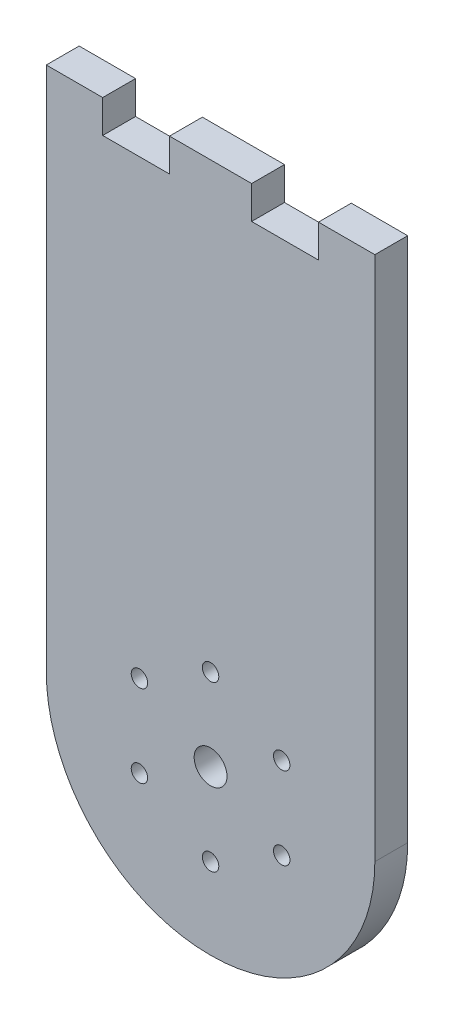
ISO-10303-21;
HEADER;
FILE_DESCRIPTION(('STEP AP214'),'2;1');
FILE_NAME('part.step','',(''),(''),'','','');
FILE_SCHEMA(('AUTOMOTIVE_DESIGN { 1 0 10303 214 1 1 1 1 }'));
ENDSEC;
DATA;
#1=APPLICATION_CONTEXT('core data for automotive mechanical design processes');
#2=APPLICATION_PROTOCOL_DEFINITION('international standard','automotive_design',2000,#1);
#3=PRODUCT_CONTEXT('',#1,'mechanical');
#4=PRODUCT('Part','Part','',(#3));
#5=PRODUCT_RELATED_PRODUCT_CATEGORY('part','',(#4));
#6=PRODUCT_DEFINITION_FORMATION('','',#4);
#7=PRODUCT_DEFINITION_CONTEXT('part definition',#1,'design');
#8=PRODUCT_DEFINITION('design','',#6,#7);
#9=PRODUCT_DEFINITION_SHAPE('','',#8);
#10=(LENGTH_UNIT() NAMED_UNIT(*) SI_UNIT(.MILLI.,.METRE.));
#11=(NAMED_UNIT(*) PLANE_ANGLE_UNIT() SI_UNIT($,.RADIAN.));
#12=(NAMED_UNIT(*) SI_UNIT($,.STERADIAN.) SOLID_ANGLE_UNIT());
#13=UNCERTAINTY_MEASURE_WITH_UNIT(LENGTH_MEASURE(1.E-05),#10,'distance_accuracy_value','');
#14=(GEOMETRIC_REPRESENTATION_CONTEXT(3) GLOBAL_UNCERTAINTY_ASSIGNED_CONTEXT((#13)) GLOBAL_UNIT_ASSIGNED_CONTEXT((#10,
#11,#12)) REPRESENTATION_CONTEXT('',''));
#15=CARTESIAN_POINT('',(0.,0.,0.));
#16=DIRECTION('',(0.,0.,1.));
#17=DIRECTION('',(1.,0.,0.));
#18=AXIS2_PLACEMENT_3D('',#15,#16,#17);
#19=CARTESIAN_POINT('',(-0.100000000000006,-16.55,3.));
#20=DIRECTION('',(0.,0.,1.));
#21=DIRECTION('',(1.,0.,0.));
#22=AXIS2_PLACEMENT_3D('',#19,#20,#21);
#23=PLANE('',#22);
#24=CARTESIAN_POINT('',(-6.49519052838329,-20.3,3.));
#25=DIRECTION('',(0.,0.,1.));
#26=DIRECTION('',(1.,0.,0.));
#27=AXIS2_PLACEMENT_3D('',#24,#25,#26);
#28=CIRCLE('',#27,0.750000000000064);
#29=CARTESIAN_POINT('',(-5.74519052838323,-20.3,3.));
#30=VERTEX_POINT('',#29);
#31=EDGE_CURVE('E329',#30,#30,#28,.T.);
#32=ORIENTED_EDGE('',*,*,#31,.F.);
#33=EDGE_LOOP('',(#32));
#34=FACE_BOUND('',#33,.T.);
#35=CARTESIAN_POINT('',(6.49519052838329,-20.3,3.));
#36=DIRECTION('',(0.,0.,1.));
#37=DIRECTION('',(1.,0.,0.));
#38=AXIS2_PLACEMENT_3D('',#35,#36,#37);
#39=CIRCLE('',#38,0.750000000000063);
#40=CARTESIAN_POINT('',(7.24519052838335,-20.3,3.));
#41=VERTEX_POINT('',#40);
#42=EDGE_CURVE('E341',#41,#41,#39,.T.);
#43=ORIENTED_EDGE('',*,*,#42,.F.);
#44=EDGE_LOOP('',(#43));
#45=FACE_BOUND('',#44,.T.);
#46=CARTESIAN_POINT('',(0.,-16.55,3.));
#47=DIRECTION('',(0.,0.,1.));
#48=DIRECTION('',(1.,0.,0.));
#49=AXIS2_PLACEMENT_3D('',#46,#47,#48);
#50=CIRCLE('',#49,1.5);
#51=CARTESIAN_POINT('',(1.5,-16.55,3.));
#52=VERTEX_POINT('',#51);
#53=EDGE_CURVE('E353',#52,#52,#50,.T.);
#54=ORIENTED_EDGE('',*,*,#53,.F.);
#55=EDGE_LOOP('',(#54));
#56=FACE_BOUND('',#55,.T.);
#57=DIRECTION('',(0.,-1.,0.));
#58=VECTOR('',#57,1.);
#59=CARTESIAN_POINT('',(-15.,31.45,3.));
#60=LINE('',#59,#58);
#61=CARTESIAN_POINT('',(-15.,31.45,3.));
#62=VERTEX_POINT('',#61);
#63=CARTESIAN_POINT('',(-15.,-16.55,3.));
#64=VERTEX_POINT('',#63);
#65=EDGE_CURVE('E193',#62,#64,#60,.T.);
#66=ORIENTED_EDGE('',*,*,#65,.T.);
#67=CARTESIAN_POINT('',(-0.100000000000006,-16.55,3.));
#68=DIRECTION('',(0.,0.,1.));
#69=DIRECTION('',(1.,0.,0.));
#70=AXIS2_PLACEMENT_3D('',#67,#68,#69);
#71=CIRCLE('',#70,14.9);
#72=CARTESIAN_POINT('',(-0.100000000000006,-31.45,3.));
#73=VERTEX_POINT('',#72);
#74=EDGE_CURVE('E111',#64,#73,#71,.T.);
#75=ORIENTED_EDGE('',*,*,#74,.T.);
#76=DIRECTION('',(1.,0.,0.));
#77=VECTOR('',#76,1.);
#78=CARTESIAN_POINT('',(-0.100000000000006,-31.45,3.));
#79=LINE('',#78,#77);
#80=CARTESIAN_POINT('',(0.0999999999999898,-31.45,3.));
#81=VERTEX_POINT('',#80);
#82=EDGE_CURVE('E226',#73,#81,#79,.T.);
#83=ORIENTED_EDGE('',*,*,#82,.T.);
#84=CARTESIAN_POINT('',(0.0999999999999926,-16.55,3.));
#85=DIRECTION('',(0.,0.,1.));
#86=DIRECTION('',(1.,0.,0.));
#87=AXIS2_PLACEMENT_3D('',#84,#85,#86);
#88=CIRCLE('',#87,14.9);
#89=CARTESIAN_POINT('',(15.,-16.55,3.));
#90=VERTEX_POINT('',#89);
#91=EDGE_CURVE('E245',#81,#90,#88,.T.);
#92=ORIENTED_EDGE('',*,*,#91,.T.);
#93=DIRECTION('',(0.,1.,0.));
#94=VECTOR('',#93,1.);
#95=CARTESIAN_POINT('',(15.,31.45,3.));
#96=LINE('',#95,#94);
#97=CARTESIAN_POINT('',(15.,31.45,3.));
#98=VERTEX_POINT('',#97);
#99=EDGE_CURVE('E242',#90,#98,#96,.T.);
#100=ORIENTED_EDGE('',*,*,#99,.T.);
#101=DIRECTION('',(-1.,0.,0.));
#102=VECTOR('',#101,1.);
#103=CARTESIAN_POINT('',(9.84999999999998,31.45,3.));
#104=LINE('',#103,#102);
#105=CARTESIAN_POINT('',(9.84999999999998,31.45,3.));
#106=VERTEX_POINT('',#105);
#107=EDGE_CURVE('E244',#98,#106,#104,.T.);
#108=ORIENTED_EDGE('',*,*,#107,.T.);
#109=DIRECTION('',(0.,-1.,0.));
#110=VECTOR('',#109,1.);
#111=CARTESIAN_POINT('',(9.84999999999998,28.45,3.));
#112=LINE('',#111,#110);
#113=CARTESIAN_POINT('',(9.84999999999998,28.45,3.));
#114=VERTEX_POINT('',#113);
#115=EDGE_CURVE('E247',#106,#114,#112,.T.);
#116=ORIENTED_EDGE('',*,*,#115,.T.);
#117=DIRECTION('',(-1.,0.,0.));
#118=VECTOR('',#117,1.);
#119=CARTESIAN_POINT('',(3.74999999999999,28.45,3.));
#120=LINE('',#119,#118);
#121=CARTESIAN_POINT('',(3.74999999999999,28.45,3.));
#122=VERTEX_POINT('',#121);
#123=EDGE_CURVE('E253',#114,#122,#120,.T.);
#124=ORIENTED_EDGE('',*,*,#123,.T.);
#125=DIRECTION('',(0.,1.,0.));
#126=VECTOR('',#125,1.);
#127=CARTESIAN_POINT('',(3.74999999999999,31.45,3.));
#128=LINE('',#127,#126);
#129=CARTESIAN_POINT('',(3.74999999999999,31.45,3.));
#130=VERTEX_POINT('',#129);
#131=EDGE_CURVE('E255',#122,#130,#128,.T.);
#132=ORIENTED_EDGE('',*,*,#131,.T.);
#133=DIRECTION('',(-1.,0.,0.));
#134=VECTOR('',#133,1.);
#135=CARTESIAN_POINT('',(-3.75,31.45,3.));
#136=LINE('',#135,#134);
#137=CARTESIAN_POINT('',(-3.75,31.45,3.));
#138=VERTEX_POINT('',#137);
#139=EDGE_CURVE('E257',#130,#138,#136,.T.);
#140=ORIENTED_EDGE('',*,*,#139,.T.);
#141=DIRECTION('',(0.,-1.,0.));
#142=VECTOR('',#141,1.);
#143=CARTESIAN_POINT('',(-3.75,28.45,3.));
#144=LINE('',#143,#142);
#145=CARTESIAN_POINT('',(-3.75,28.45,3.));
#146=VERTEX_POINT('',#145);
#147=EDGE_CURVE('E148',#138,#146,#144,.T.);
#148=ORIENTED_EDGE('',*,*,#147,.T.);
#149=DIRECTION('',(-1.,0.,0.));
#150=VECTOR('',#149,1.);
#151=CARTESIAN_POINT('',(-9.85000000000002,28.45,3.));
#152=LINE('',#151,#150);
#153=CARTESIAN_POINT('',(-9.85000000000002,28.45,3.));
#154=VERTEX_POINT('',#153);
#155=EDGE_CURVE('E142',#146,#154,#152,.T.);
#156=ORIENTED_EDGE('',*,*,#155,.T.);
#157=DIRECTION('',(0.,1.,0.));
#158=VECTOR('',#157,1.);
#159=CARTESIAN_POINT('',(-9.85000000000002,31.45,3.));
#160=LINE('',#159,#158);
#161=CARTESIAN_POINT('',(-9.85000000000002,31.45,3.));
#162=VERTEX_POINT('',#161);
#163=EDGE_CURVE('E146',#154,#162,#160,.T.);
#164=ORIENTED_EDGE('',*,*,#163,.T.);
#165=DIRECTION('',(-1.,0.,0.));
#166=VECTOR('',#165,1.);
#167=CARTESIAN_POINT('',(-15.,31.45,3.));
#168=LINE('',#167,#166);
#169=EDGE_CURVE('E50',#162,#62,#168,.T.);
#170=ORIENTED_EDGE('',*,*,#169,.T.);
#171=EDGE_LOOP('',(#66,#75,#83,#92,#100,#108,#116,#124,#132,#140,#148,#156,#164,#170));
#172=FACE_BOUND('',#171,.T.);
#173=CARTESIAN_POINT('',(0.,-9.05000000000001,3.));
#174=DIRECTION('',(0.,0.,1.));
#175=DIRECTION('',(1.,0.,0.));
#176=AXIS2_PLACEMENT_3D('',#173,#174,#175);
#177=CIRCLE('',#176,0.750000000000086);
#178=CARTESIAN_POINT('',(0.750000000000081,-9.05000000000001,3.));
#179=VERTEX_POINT('',#178);
#180=EDGE_CURVE('E170',#179,#179,#177,.T.);
#181=ORIENTED_EDGE('',*,*,#180,.F.);
#182=EDGE_LOOP('',(#181));
#183=FACE_BOUND('',#182,.T.);
#184=CARTESIAN_POINT('',(6.49519052838329,-12.8,3.));
#185=DIRECTION('',(0.,0.,1.));
#186=DIRECTION('',(1.,0.,0.));
#187=AXIS2_PLACEMENT_3D('',#184,#185,#186);
#188=CIRCLE('',#187,0.750000000000062);
#189=CARTESIAN_POINT('',(7.24519052838335,-12.8,3.));
#190=VERTEX_POINT('',#189);
#191=EDGE_CURVE('E347',#190,#190,#188,.T.);
#192=ORIENTED_EDGE('',*,*,#191,.F.);
#193=EDGE_LOOP('',(#192));
#194=FACE_BOUND('',#193,.T.);
#195=CARTESIAN_POINT('',(0.,-24.05,3.));
#196=DIRECTION('',(0.,0.,1.));
#197=DIRECTION('',(1.,0.,0.));
#198=AXIS2_PLACEMENT_3D('',#195,#196,#197);
#199=CIRCLE('',#198,0.750000000000064);
#200=CARTESIAN_POINT('',(0.750000000000081,-24.05,3.));
#201=VERTEX_POINT('',#200);
#202=EDGE_CURVE('E335',#201,#201,#199,.T.);
#203=ORIENTED_EDGE('',*,*,#202,.F.);
#204=EDGE_LOOP('',(#203));
#205=FACE_BOUND('',#204,.T.);
#206=CARTESIAN_POINT('',(-6.4951905283833,-12.8,3.));
#207=DIRECTION('',(0.,0.,1.));
#208=DIRECTION('',(1.,0.,0.));
#209=AXIS2_PLACEMENT_3D('',#206,#207,#208);
#210=CIRCLE('',#209,0.750000000000066);
#211=CARTESIAN_POINT('',(-5.74519052838323,-12.8,3.));
#212=VERTEX_POINT('',#211);
#213=EDGE_CURVE('E320',#212,#212,#210,.T.);
#214=ORIENTED_EDGE('',*,*,#213,.F.);
#215=EDGE_LOOP('',(#214));
#216=FACE_BOUND('',#215,.T.);
#217=ADVANCED_FACE('F33',(#34,#45,#56,#172,#183,#194,#205,#216),#23,.T.);
#218=CARTESIAN_POINT('',(-0.100000000000006,-16.55,0.));
#219=DIRECTION('',(0.,0.,1.));
#220=DIRECTION('',(1.,0.,0.));
#221=AXIS2_PLACEMENT_3D('',#218,#219,#220);
#222=PLANE('',#221);
#223=DIRECTION('',(0.,-1.,0.));
#224=VECTOR('',#223,1.);
#225=CARTESIAN_POINT('',(-15.,31.45,0.));
#226=LINE('',#225,#224);
#227=CARTESIAN_POINT('',(-15.,31.45,0.));
#228=VERTEX_POINT('',#227);
#229=CARTESIAN_POINT('',(-15.,-16.55,0.));
#230=VERTEX_POINT('',#229);
#231=EDGE_CURVE('E166',#228,#230,#226,.T.);
#232=ORIENTED_EDGE('',*,*,#231,.F.);
#233=DIRECTION('',(-1.,0.,0.));
#234=VECTOR('',#233,1.);
#235=CARTESIAN_POINT('',(-15.,31.45,0.));
#236=LINE('',#235,#234);
#237=CARTESIAN_POINT('',(-9.85000000000002,31.45,0.));
#238=VERTEX_POINT('',#237);
#239=EDGE_CURVE('E103',#238,#228,#236,.T.);
#240=ORIENTED_EDGE('',*,*,#239,.F.);
#241=DIRECTION('',(0.,1.,0.));
#242=VECTOR('',#241,1.);
#243=CARTESIAN_POINT('',(-9.85000000000002,31.45,0.));
#244=LINE('',#243,#242);
#245=CARTESIAN_POINT('',(-9.85000000000002,28.45,0.));
#246=VERTEX_POINT('',#245);
#247=EDGE_CURVE('E97',#246,#238,#244,.T.);
#248=ORIENTED_EDGE('',*,*,#247,.F.);
#249=DIRECTION('',(-1.,0.,0.));
#250=VECTOR('',#249,1.);
#251=CARTESIAN_POINT('',(-9.85000000000002,28.45,0.));
#252=LINE('',#251,#250);
#253=CARTESIAN_POINT('',(-3.75,28.45,0.));
#254=VERTEX_POINT('',#253);
#255=EDGE_CURVE('E156',#254,#246,#252,.T.);
#256=ORIENTED_EDGE('',*,*,#255,.F.);
#257=DIRECTION('',(0.,-1.,0.));
#258=VECTOR('',#257,1.);
#259=CARTESIAN_POINT('',(-3.75,28.45,0.));
#260=LINE('',#259,#258);
#261=CARTESIAN_POINT('',(-3.75,31.45,0.));
#262=VERTEX_POINT('',#261);
#263=EDGE_CURVE('E188',#262,#254,#260,.T.);
#264=ORIENTED_EDGE('',*,*,#263,.F.);
#265=DIRECTION('',(-1.,0.,0.));
#266=VECTOR('',#265,1.);
#267=CARTESIAN_POINT('',(-3.75,31.45,0.));
#268=LINE('',#267,#266);
#269=CARTESIAN_POINT('',(3.74999999999999,31.45,0.));
#270=VERTEX_POINT('',#269);
#271=EDGE_CURVE('E186',#270,#262,#268,.T.);
#272=ORIENTED_EDGE('',*,*,#271,.F.);
#273=DIRECTION('',(0.,1.,0.));
#274=VECTOR('',#273,1.);
#275=CARTESIAN_POINT('',(3.74999999999999,31.45,0.));
#276=LINE('',#275,#274);
#277=CARTESIAN_POINT('',(3.74999999999999,28.45,0.));
#278=VERTEX_POINT('',#277);
#279=EDGE_CURVE('E184',#278,#270,#276,.T.);
#280=ORIENTED_EDGE('',*,*,#279,.F.);
#281=DIRECTION('',(-1.,0.,0.));
#282=VECTOR('',#281,1.);
#283=CARTESIAN_POINT('',(3.74999999999999,28.45,0.));
#284=LINE('',#283,#282);
#285=CARTESIAN_POINT('',(9.84999999999998,28.45,0.));
#286=VERTEX_POINT('',#285);
#287=EDGE_CURVE('E182',#286,#278,#284,.T.);
#288=ORIENTED_EDGE('',*,*,#287,.F.);
#289=DIRECTION('',(0.,-1.,0.));
#290=VECTOR('',#289,1.);
#291=CARTESIAN_POINT('',(9.84999999999998,28.45,0.));
#292=LINE('',#291,#290);
#293=CARTESIAN_POINT('',(9.84999999999998,31.45,0.));
#294=VERTEX_POINT('',#293);
#295=EDGE_CURVE('E180',#294,#286,#292,.T.);
#296=ORIENTED_EDGE('',*,*,#295,.F.);
#297=DIRECTION('',(-1.,0.,0.));
#298=VECTOR('',#297,1.);
#299=CARTESIAN_POINT('',(9.84999999999998,31.45,0.));
#300=LINE('',#299,#298);
#301=CARTESIAN_POINT('',(15.,31.45,0.));
#302=VERTEX_POINT('',#301);
#303=EDGE_CURVE('E178',#302,#294,#300,.T.);
#304=ORIENTED_EDGE('',*,*,#303,.F.);
#305=DIRECTION('',(0.,1.,0.));
#306=VECTOR('',#305,1.);
#307=CARTESIAN_POINT('',(15.,31.45,0.));
#308=LINE('',#307,#306);
#309=CARTESIAN_POINT('',(15.,-16.55,0.));
#310=VERTEX_POINT('',#309);
#311=EDGE_CURVE('E176',#310,#302,#308,.T.);
#312=ORIENTED_EDGE('',*,*,#311,.F.);
#313=CARTESIAN_POINT('',(0.0999999999999926,-16.55,0.));
#314=DIRECTION('',(0.,0.,1.));
#315=DIRECTION('',(1.,0.,0.));
#316=AXIS2_PLACEMENT_3D('',#313,#314,#315);
#317=CIRCLE('',#316,14.9);
#318=CARTESIAN_POINT('',(0.0999999999999898,-31.45,0.));
#319=VERTEX_POINT('',#318);
#320=EDGE_CURVE('E174',#319,#310,#317,.T.);
#321=ORIENTED_EDGE('',*,*,#320,.F.);
#322=DIRECTION('',(1.,0.,0.));
#323=VECTOR('',#322,1.);
#324=CARTESIAN_POINT('',(-0.100000000000006,-31.45,0.));
#325=LINE('',#324,#323);
#326=CARTESIAN_POINT('',(-0.100000000000006,-31.45,0.));
#327=VERTEX_POINT('',#326);
#328=EDGE_CURVE('E172',#327,#319,#325,.T.);
#329=ORIENTED_EDGE('',*,*,#328,.F.);
#330=CARTESIAN_POINT('',(-0.100000000000006,-16.55,0.));
#331=DIRECTION('',(0.,0.,1.));
#332=DIRECTION('',(1.,0.,0.));
#333=AXIS2_PLACEMENT_3D('',#330,#331,#332);
#334=CIRCLE('',#333,14.9);
#335=EDGE_CURVE('E169',#230,#327,#334,.T.);
#336=ORIENTED_EDGE('',*,*,#335,.F.);
#337=EDGE_LOOP('',(#232,#240,#248,#256,#264,#272,#280,#288,#296,#304,#312,#321,#329,#336));
#338=FACE_BOUND('',#337,.T.);
#339=CARTESIAN_POINT('',(0.,-9.05000000000001,0.));
#340=DIRECTION('',(0.,0.,1.));
#341=DIRECTION('',(1.,0.,0.));
#342=AXIS2_PLACEMENT_3D('',#339,#340,#341);
#343=CIRCLE('',#342,0.750000000000086);
#344=CARTESIAN_POINT('',(0.750000000000081,-9.05000000000001,0.));
#345=VERTEX_POINT('',#344);
#346=EDGE_CURVE('E356',#345,#345,#343,.T.);
#347=ORIENTED_EDGE('',*,*,#346,.T.);
#348=EDGE_LOOP('',(#347));
#349=FACE_BOUND('',#348,.T.);
#350=CARTESIAN_POINT('',(0.,-16.55,0.));
#351=DIRECTION('',(0.,0.,1.));
#352=DIRECTION('',(1.,0.,0.));
#353=AXIS2_PLACEMENT_3D('',#350,#351,#352);
#354=CIRCLE('',#353,1.5);
#355=CARTESIAN_POINT('',(1.5,-16.55,0.));
#356=VERTEX_POINT('',#355);
#357=EDGE_CURVE('E350',#356,#356,#354,.T.);
#358=ORIENTED_EDGE('',*,*,#357,.T.);
#359=EDGE_LOOP('',(#358));
#360=FACE_BOUND('',#359,.T.);
#361=CARTESIAN_POINT('',(6.49519052838329,-12.8,0.));
#362=DIRECTION('',(0.,0.,1.));
#363=DIRECTION('',(1.,0.,0.));
#364=AXIS2_PLACEMENT_3D('',#361,#362,#363);
#365=CIRCLE('',#364,0.750000000000062);
#366=CARTESIAN_POINT('',(7.24519052838335,-12.8,0.));
#367=VERTEX_POINT('',#366);
#368=EDGE_CURVE('E344',#367,#367,#365,.T.);
#369=ORIENTED_EDGE('',*,*,#368,.T.);
#370=EDGE_LOOP('',(#369));
#371=FACE_BOUND('',#370,.T.);
#372=CARTESIAN_POINT('',(6.49519052838329,-20.3,0.));
#373=DIRECTION('',(0.,0.,1.));
#374=DIRECTION('',(1.,0.,0.));
#375=AXIS2_PLACEMENT_3D('',#372,#373,#374);
#376=CIRCLE('',#375,0.750000000000063);
#377=CARTESIAN_POINT('',(7.24519052838335,-20.3,0.));
#378=VERTEX_POINT('',#377);
#379=EDGE_CURVE('E338',#378,#378,#376,.T.);
#380=ORIENTED_EDGE('',*,*,#379,.T.);
#381=EDGE_LOOP('',(#380));
#382=FACE_BOUND('',#381,.T.);
#383=CARTESIAN_POINT('',(0.,-24.05,0.));
#384=DIRECTION('',(0.,0.,1.));
#385=DIRECTION('',(1.,0.,0.));
#386=AXIS2_PLACEMENT_3D('',#383,#384,#385);
#387=CIRCLE('',#386,0.750000000000064);
#388=CARTESIAN_POINT('',(0.750000000000081,-24.05,0.));
#389=VERTEX_POINT('',#388);
#390=EDGE_CURVE('E332',#389,#389,#387,.T.);
#391=ORIENTED_EDGE('',*,*,#390,.T.);
#392=EDGE_LOOP('',(#391));
#393=FACE_BOUND('',#392,.T.);
#394=CARTESIAN_POINT('',(-6.49519052838329,-20.3,0.));
#395=DIRECTION('',(0.,0.,1.));
#396=DIRECTION('',(1.,0.,0.));
#397=AXIS2_PLACEMENT_3D('',#394,#395,#396);
#398=CIRCLE('',#397,0.750000000000064);
#399=CARTESIAN_POINT('',(-5.74519052838323,-20.3,0.));
#400=VERTEX_POINT('',#399);
#401=EDGE_CURVE('E326',#400,#400,#398,.T.);
#402=ORIENTED_EDGE('',*,*,#401,.T.);
#403=EDGE_LOOP('',(#402));
#404=FACE_BOUND('',#403,.T.);
#405=CARTESIAN_POINT('',(-6.4951905283833,-12.8,0.));
#406=DIRECTION('',(0.,0.,1.));
#407=DIRECTION('',(1.,0.,0.));
#408=AXIS2_PLACEMENT_3D('',#405,#406,#407);
#409=CIRCLE('',#408,0.750000000000066);
#410=CARTESIAN_POINT('',(-5.74519052838323,-12.8,0.));
#411=VERTEX_POINT('',#410);
#412=EDGE_CURVE('E323',#411,#411,#409,.T.);
#413=ORIENTED_EDGE('',*,*,#412,.T.);
#414=EDGE_LOOP('',(#413));
#415=FACE_BOUND('',#414,.T.);
#416=ADVANCED_FACE('F230',(#338,#349,#360,#371,#382,#393,#404,#415),#222,.F.);
#417=CARTESIAN_POINT('',(-15.,31.45,3.));
#418=DIRECTION('',(1.,0.,0.));
#419=DIRECTION('',(0.,0.,-1.));
#420=AXIS2_PLACEMENT_3D('',#417,#418,#419);
#421=PLANE('',#420);
#422=ORIENTED_EDGE('',*,*,#231,.T.);
#423=DIRECTION('',(0.,0.,-1.));
#424=VECTOR('',#423,1.);
#425=CARTESIAN_POINT('',(-15.,-16.55,3.));
#426=LINE('',#425,#424);
#427=EDGE_CURVE('E11',#64,#230,#426,.T.);
#428=ORIENTED_EDGE('',*,*,#427,.F.);
#429=ORIENTED_EDGE('',*,*,#65,.F.);
#430=DIRECTION('',(0.,0.,-1.));
#431=VECTOR('',#430,1.);
#432=CARTESIAN_POINT('',(-15.,31.45,3.));
#433=LINE('',#432,#431);
#434=EDGE_CURVE('E162',#62,#228,#433,.T.);
#435=ORIENTED_EDGE('',*,*,#434,.T.);
#436=EDGE_LOOP('',(#422,#428,#429,#435));
#437=FACE_BOUND('',#436,.T.);
#438=ADVANCED_FACE('F35',(#437),#421,.F.);
#439=CARTESIAN_POINT('',(-0.100000000000006,-16.55,3.));
#440=DIRECTION('',(0.,0.,-1.));
#441=DIRECTION('',(-1.,0.,0.));
#442=AXIS2_PLACEMENT_3D('',#439,#440,#441);
#443=CYLINDRICAL_SURFACE('',#442,14.9);
#444=ORIENTED_EDGE('',*,*,#335,.T.);
#445=DIRECTION('',(0.,0.,-1.));
#446=VECTOR('',#445,1.);
#447=CARTESIAN_POINT('',(-0.100000000000006,-31.45,3.));
#448=LINE('',#447,#446);
#449=EDGE_CURVE('E42',#73,#327,#448,.T.);
#450=ORIENTED_EDGE('',*,*,#449,.F.);
#451=ORIENTED_EDGE('',*,*,#74,.F.);
#452=ORIENTED_EDGE('',*,*,#427,.T.);
#453=EDGE_LOOP('',(#444,#450,#451,#452));
#454=FACE_BOUND('',#453,.T.);
#455=ADVANCED_FACE('F513',(#454),#443,.T.);
#456=CARTESIAN_POINT('',(-0.100000000000006,-31.45,3.));
#457=DIRECTION('',(0.,1.,0.));
#458=DIRECTION('',(0.,0.,1.));
#459=AXIS2_PLACEMENT_3D('',#456,#457,#458);
#460=PLANE('',#459);
#461=ORIENTED_EDGE('',*,*,#328,.T.);
#462=DIRECTION('',(0.,0.,-1.));
#463=VECTOR('',#462,1.);
#464=CARTESIAN_POINT('',(0.0999999999999898,-31.45,3.));
#465=LINE('',#464,#463);
#466=EDGE_CURVE('E218',#81,#319,#465,.T.);
#467=ORIENTED_EDGE('',*,*,#466,.F.);
#468=ORIENTED_EDGE('',*,*,#82,.F.);
#469=ORIENTED_EDGE('',*,*,#449,.T.);
#470=EDGE_LOOP('',(#461,#467,#468,#469));
#471=FACE_BOUND('',#470,.T.);
#472=ADVANCED_FACE('F224',(#471),#460,.F.);
#473=CARTESIAN_POINT('',(0.0999999999999926,-16.55,3.));
#474=DIRECTION('',(0.,0.,-1.));
#475=DIRECTION('',(-1.,0.,0.));
#476=AXIS2_PLACEMENT_3D('',#473,#474,#475);
#477=CYLINDRICAL_SURFACE('',#476,14.9);
#478=ORIENTED_EDGE('',*,*,#320,.T.);
#479=DIRECTION('',(0.,0.,-1.));
#480=VECTOR('',#479,1.);
#481=CARTESIAN_POINT('',(15.,-16.55,3.));
#482=LINE('',#481,#480);
#483=EDGE_CURVE('E215',#90,#310,#482,.T.);
#484=ORIENTED_EDGE('',*,*,#483,.F.);
#485=ORIENTED_EDGE('',*,*,#91,.F.);
#486=ORIENTED_EDGE('',*,*,#466,.T.);
#487=EDGE_LOOP('',(#478,#484,#485,#486));
#488=FACE_BOUND('',#487,.T.);
#489=ADVANCED_FACE('F236',(#488),#477,.T.);
#490=CARTESIAN_POINT('',(15.,31.45,3.));
#491=DIRECTION('',(-1.,0.,0.));
#492=DIRECTION('',(0.,0.,1.));
#493=AXIS2_PLACEMENT_3D('',#490,#491,#492);
#494=PLANE('',#493);
#495=ORIENTED_EDGE('',*,*,#311,.T.);
#496=DIRECTION('',(0.,0.,-1.));
#497=VECTOR('',#496,1.);
#498=CARTESIAN_POINT('',(15.,31.45,3.));
#499=LINE('',#498,#497);
#500=EDGE_CURVE('E212',#98,#302,#499,.T.);
#501=ORIENTED_EDGE('',*,*,#500,.F.);
#502=ORIENTED_EDGE('',*,*,#99,.F.);
#503=ORIENTED_EDGE('',*,*,#483,.T.);
#504=EDGE_LOOP('',(#495,#501,#502,#503));
#505=FACE_BOUND('',#504,.T.);
#506=ADVANCED_FACE('F240',(#505),#494,.F.);
#507=CARTESIAN_POINT('',(9.84999999999998,31.45,3.));
#508=DIRECTION('',(0.,-1.,0.));
#509=DIRECTION('',(1.,0.,0.));
#510=AXIS2_PLACEMENT_3D('',#507,#508,#509);
#511=PLANE('',#510);
#512=ORIENTED_EDGE('',*,*,#303,.T.);
#513=DIRECTION('',(0.,0.,-1.));
#514=VECTOR('',#513,1.);
#515=CARTESIAN_POINT('',(9.84999999999998,31.45,3.));
#516=LINE('',#515,#514);
#517=EDGE_CURVE('E209',#106,#294,#516,.T.);
#518=ORIENTED_EDGE('',*,*,#517,.F.);
#519=ORIENTED_EDGE('',*,*,#107,.F.);
#520=ORIENTED_EDGE('',*,*,#500,.T.);
#521=EDGE_LOOP('',(#512,#518,#519,#520));
#522=FACE_BOUND('',#521,.T.);
#523=ADVANCED_FACE('F478',(#522),#511,.F.);
#524=CARTESIAN_POINT('',(9.84999999999998,28.45,3.));
#525=DIRECTION('',(1.,0.,0.));
#526=DIRECTION('',(0.,0.,-1.));
#527=AXIS2_PLACEMENT_3D('',#524,#525,#526);
#528=PLANE('',#527);
#529=ORIENTED_EDGE('',*,*,#295,.T.);
#530=DIRECTION('',(0.,0.,-1.));
#531=VECTOR('',#530,1.);
#532=CARTESIAN_POINT('',(9.84999999999998,28.45,3.));
#533=LINE('',#532,#531);
#534=EDGE_CURVE('E206',#114,#286,#533,.T.);
#535=ORIENTED_EDGE('',*,*,#534,.F.);
#536=ORIENTED_EDGE('',*,*,#115,.F.);
#537=ORIENTED_EDGE('',*,*,#517,.T.);
#538=EDGE_LOOP('',(#529,#535,#536,#537));
#539=FACE_BOUND('',#538,.T.);
#540=ADVANCED_FACE('F468',(#539),#528,.F.);
#541=CARTESIAN_POINT('',(3.74999999999999,28.45,3.));
#542=DIRECTION('',(0.,-1.,0.));
#543=DIRECTION('',(0.,0.,-1.));
#544=AXIS2_PLACEMENT_3D('',#541,#542,#543);
#545=PLANE('',#544);
#546=ORIENTED_EDGE('',*,*,#287,.T.);
#547=DIRECTION('',(0.,0.,-1.));
#548=VECTOR('',#547,1.);
#549=CARTESIAN_POINT('',(3.74999999999999,28.45,3.));
#550=LINE('',#549,#548);
#551=EDGE_CURVE('E203',#122,#278,#550,.T.);
#552=ORIENTED_EDGE('',*,*,#551,.F.);
#553=ORIENTED_EDGE('',*,*,#123,.F.);
#554=ORIENTED_EDGE('',*,*,#534,.T.);
#555=EDGE_LOOP('',(#546,#552,#553,#554));
#556=FACE_BOUND('',#555,.T.);
#557=ADVANCED_FACE('F458',(#556),#545,.F.);
#558=CARTESIAN_POINT('',(3.74999999999999,31.45,3.));
#559=DIRECTION('',(-1.,0.,0.));
#560=DIRECTION('',(0.,-1.,0.));
#561=AXIS2_PLACEMENT_3D('',#558,#559,#560);
#562=PLANE('',#561);
#563=ORIENTED_EDGE('',*,*,#279,.T.);
#564=DIRECTION('',(0.,0.,-1.));
#565=VECTOR('',#564,1.);
#566=CARTESIAN_POINT('',(3.74999999999999,31.45,3.));
#567=LINE('',#566,#565);
#568=EDGE_CURVE('E200',#130,#270,#567,.T.);
#569=ORIENTED_EDGE('',*,*,#568,.F.);
#570=ORIENTED_EDGE('',*,*,#131,.F.);
#571=ORIENTED_EDGE('',*,*,#551,.T.);
#572=EDGE_LOOP('',(#563,#569,#570,#571));
#573=FACE_BOUND('',#572,.T.);
#574=ADVANCED_FACE('F449',(#573),#562,.F.);
#575=CARTESIAN_POINT('',(-3.75,31.45,3.));
#576=DIRECTION('',(0.,-1.,0.));
#577=DIRECTION('',(0.,0.,-1.));
#578=AXIS2_PLACEMENT_3D('',#575,#576,#577);
#579=PLANE('',#578);
#580=ORIENTED_EDGE('',*,*,#271,.T.);
#581=DIRECTION('',(0.,0.,-1.));
#582=VECTOR('',#581,1.);
#583=CARTESIAN_POINT('',(-3.75,31.45,3.));
#584=LINE('',#583,#582);
#585=EDGE_CURVE('E197',#138,#262,#584,.T.);
#586=ORIENTED_EDGE('',*,*,#585,.F.);
#587=ORIENTED_EDGE('',*,*,#139,.F.);
#588=ORIENTED_EDGE('',*,*,#568,.T.);
#589=EDGE_LOOP('',(#580,#586,#587,#588));
#590=FACE_BOUND('',#589,.T.);
#591=ADVANCED_FACE('F263',(#590),#579,.F.);
#592=CARTESIAN_POINT('',(-3.75,28.45,3.));
#593=DIRECTION('',(1.,0.,0.));
#594=DIRECTION('',(0.,1.,0.));
#595=AXIS2_PLACEMENT_3D('',#592,#593,#594);
#596=PLANE('',#595);
#597=ORIENTED_EDGE('',*,*,#263,.T.);
#598=DIRECTION('',(0.,0.,-1.));
#599=VECTOR('',#598,1.);
#600=CARTESIAN_POINT('',(-3.75,28.45,3.));
#601=LINE('',#600,#599);
#602=EDGE_CURVE('E157',#146,#254,#601,.T.);
#603=ORIENTED_EDGE('',*,*,#602,.F.);
#604=ORIENTED_EDGE('',*,*,#147,.F.);
#605=ORIENTED_EDGE('',*,*,#585,.T.);
#606=EDGE_LOOP('',(#597,#603,#604,#605));
#607=FACE_BOUND('',#606,.T.);
#608=ADVANCED_FACE('F267',(#607),#596,.F.);
#609=CARTESIAN_POINT('',(-9.85000000000002,28.45,3.));
#610=DIRECTION('',(0.,-1.,0.));
#611=DIRECTION('',(0.,0.,-1.));
#612=AXIS2_PLACEMENT_3D('',#609,#610,#611);
#613=PLANE('',#612);
#614=ORIENTED_EDGE('',*,*,#255,.T.);
#615=DIRECTION('',(0.,0.,-1.));
#616=VECTOR('',#615,1.);
#617=CARTESIAN_POINT('',(-9.85000000000002,28.45,3.));
#618=LINE('',#617,#616);
#619=EDGE_CURVE('E153',#154,#246,#618,.T.);
#620=ORIENTED_EDGE('',*,*,#619,.F.);
#621=ORIENTED_EDGE('',*,*,#155,.F.);
#622=ORIENTED_EDGE('',*,*,#602,.T.);
#623=EDGE_LOOP('',(#614,#620,#621,#622));
#624=FACE_BOUND('',#623,.T.);
#625=ADVANCED_FACE('F154',(#624),#613,.F.);
#626=CARTESIAN_POINT('',(-9.85000000000002,31.45,3.));
#627=DIRECTION('',(-1.,0.,0.));
#628=DIRECTION('',(0.,-1.,0.));
#629=AXIS2_PLACEMENT_3D('',#626,#627,#628);
#630=PLANE('',#629);
#631=ORIENTED_EDGE('',*,*,#247,.T.);
#632=DIRECTION('',(0.,0.,-1.));
#633=VECTOR('',#632,1.);
#634=CARTESIAN_POINT('',(-9.85000000000002,31.45,3.));
#635=LINE('',#634,#633);
#636=EDGE_CURVE('E158',#162,#238,#635,.T.);
#637=ORIENTED_EDGE('',*,*,#636,.F.);
#638=ORIENTED_EDGE('',*,*,#163,.F.);
#639=ORIENTED_EDGE('',*,*,#619,.T.);
#640=EDGE_LOOP('',(#631,#637,#638,#639));
#641=FACE_BOUND('',#640,.T.);
#642=ADVANCED_FACE('F160',(#641),#630,.F.);
#643=CARTESIAN_POINT('',(-15.,31.45,3.));
#644=DIRECTION('',(0.,-1.,0.));
#645=DIRECTION('',(0.,0.,-1.));
#646=AXIS2_PLACEMENT_3D('',#643,#644,#645);
#647=PLANE('',#646);
#648=ORIENTED_EDGE('',*,*,#239,.T.);
#649=ORIENTED_EDGE('',*,*,#434,.F.);
#650=ORIENTED_EDGE('',*,*,#169,.F.);
#651=ORIENTED_EDGE('',*,*,#636,.T.);
#652=EDGE_LOOP('',(#648,#649,#650,#651));
#653=FACE_BOUND('',#652,.T.);
#654=ADVANCED_FACE('F271',(#653),#647,.F.);
#655=CARTESIAN_POINT('',(0.,-9.05000000000001,3.));
#656=DIRECTION('',(0.,0.,-1.));
#657=DIRECTION('',(-1.,0.,0.));
#658=AXIS2_PLACEMENT_3D('',#655,#656,#657);
#659=CYLINDRICAL_SURFACE('',#658,0.750000000000086);
#660=ORIENTED_EDGE('',*,*,#180,.T.);
#661=EDGE_LOOP('',(#660));
#662=FACE_BOUND('',#661,.T.);
#663=ORIENTED_EDGE('',*,*,#346,.F.);
#664=EDGE_LOOP('',(#663));
#665=FACE_BOUND('',#664,.T.);
#666=ADVANCED_FACE('F273',(#662,#665),#659,.F.);
#667=CARTESIAN_POINT('',(0.,-16.55,3.));
#668=DIRECTION('',(0.,0.,-1.));
#669=DIRECTION('',(-1.,0.,0.));
#670=AXIS2_PLACEMENT_3D('',#667,#668,#669);
#671=CYLINDRICAL_SURFACE('',#670,1.5);
#672=ORIENTED_EDGE('',*,*,#53,.T.);
#673=EDGE_LOOP('',(#672));
#674=FACE_BOUND('',#673,.T.);
#675=ORIENTED_EDGE('',*,*,#357,.F.);
#676=EDGE_LOOP('',(#675));
#677=FACE_BOUND('',#676,.T.);
#678=ADVANCED_FACE('F279',(#674,#677),#671,.F.);
#679=CARTESIAN_POINT('',(6.49519052838329,-12.8,3.));
#680=DIRECTION('',(0.,0.,-1.));
#681=DIRECTION('',(-1.,0.,0.));
#682=AXIS2_PLACEMENT_3D('',#679,#680,#681);
#683=CYLINDRICAL_SURFACE('',#682,0.750000000000062);
#684=ORIENTED_EDGE('',*,*,#191,.T.);
#685=EDGE_LOOP('',(#684));
#686=FACE_BOUND('',#685,.T.);
#687=ORIENTED_EDGE('',*,*,#368,.F.);
#688=EDGE_LOOP('',(#687));
#689=FACE_BOUND('',#688,.T.);
#690=ADVANCED_FACE('F295',(#686,#689),#683,.F.);
#691=CARTESIAN_POINT('',(6.49519052838329,-20.3,3.));
#692=DIRECTION('',(0.,0.,-1.));
#693=DIRECTION('',(-1.,0.,0.));
#694=AXIS2_PLACEMENT_3D('',#691,#692,#693);
#695=CYLINDRICAL_SURFACE('',#694,0.750000000000063);
#696=ORIENTED_EDGE('',*,*,#42,.T.);
#697=EDGE_LOOP('',(#696));
#698=FACE_BOUND('',#697,.T.);
#699=ORIENTED_EDGE('',*,*,#379,.F.);
#700=EDGE_LOOP('',(#699));
#701=FACE_BOUND('',#700,.T.);
#702=ADVANCED_FACE('F299',(#698,#701),#695,.F.);
#703=CARTESIAN_POINT('',(0.,-24.05,3.));
#704=DIRECTION('',(0.,0.,-1.));
#705=DIRECTION('',(-1.,0.,0.));
#706=AXIS2_PLACEMENT_3D('',#703,#704,#705);
#707=CYLINDRICAL_SURFACE('',#706,0.750000000000064);
#708=ORIENTED_EDGE('',*,*,#202,.T.);
#709=EDGE_LOOP('',(#708));
#710=FACE_BOUND('',#709,.T.);
#711=ORIENTED_EDGE('',*,*,#390,.F.);
#712=EDGE_LOOP('',(#711));
#713=FACE_BOUND('',#712,.T.);
#714=ADVANCED_FACE('F303',(#710,#713),#707,.F.);
#715=CARTESIAN_POINT('',(-6.49519052838329,-20.3,3.));
#716=DIRECTION('',(0.,0.,-1.));
#717=DIRECTION('',(-1.,0.,0.));
#718=AXIS2_PLACEMENT_3D('',#715,#716,#717);
#719=CYLINDRICAL_SURFACE('',#718,0.750000000000064);
#720=ORIENTED_EDGE('',*,*,#31,.T.);
#721=EDGE_LOOP('',(#720));
#722=FACE_BOUND('',#721,.T.);
#723=ORIENTED_EDGE('',*,*,#401,.F.);
#724=EDGE_LOOP('',(#723));
#725=FACE_BOUND('',#724,.T.);
#726=ADVANCED_FACE('F307',(#722,#725),#719,.F.);
#727=CARTESIAN_POINT('',(-6.4951905283833,-12.8,3.));
#728=DIRECTION('',(0.,0.,-1.));
#729=DIRECTION('',(-1.,0.,0.));
#730=AXIS2_PLACEMENT_3D('',#727,#728,#729);
#731=CYLINDRICAL_SURFACE('',#730,0.750000000000066);
#732=ORIENTED_EDGE('',*,*,#213,.T.);
#733=EDGE_LOOP('',(#732));
#734=FACE_BOUND('',#733,.T.);
#735=ORIENTED_EDGE('',*,*,#412,.F.);
#736=EDGE_LOOP('',(#735));
#737=FACE_BOUND('',#736,.T.);
#738=ADVANCED_FACE('F311',(#734,#737),#731,.F.);
#739=CLOSED_SHELL('',(#217,#416,#438,#455,#472,#489,#506,#523,#540,#557,#574,#591,#608,#625,
#642,#654,#666,#678,#690,#702,#714,#726,#738));
#740=MANIFOLD_SOLID_BREP('B2',#739);
#741=ADVANCED_BREP_SHAPE_REPRESENTATION('',(#18,#740),#14);
#742=SHAPE_DEFINITION_REPRESENTATION(#9,#741);
ENDSEC;
END-ISO-10303-21;
